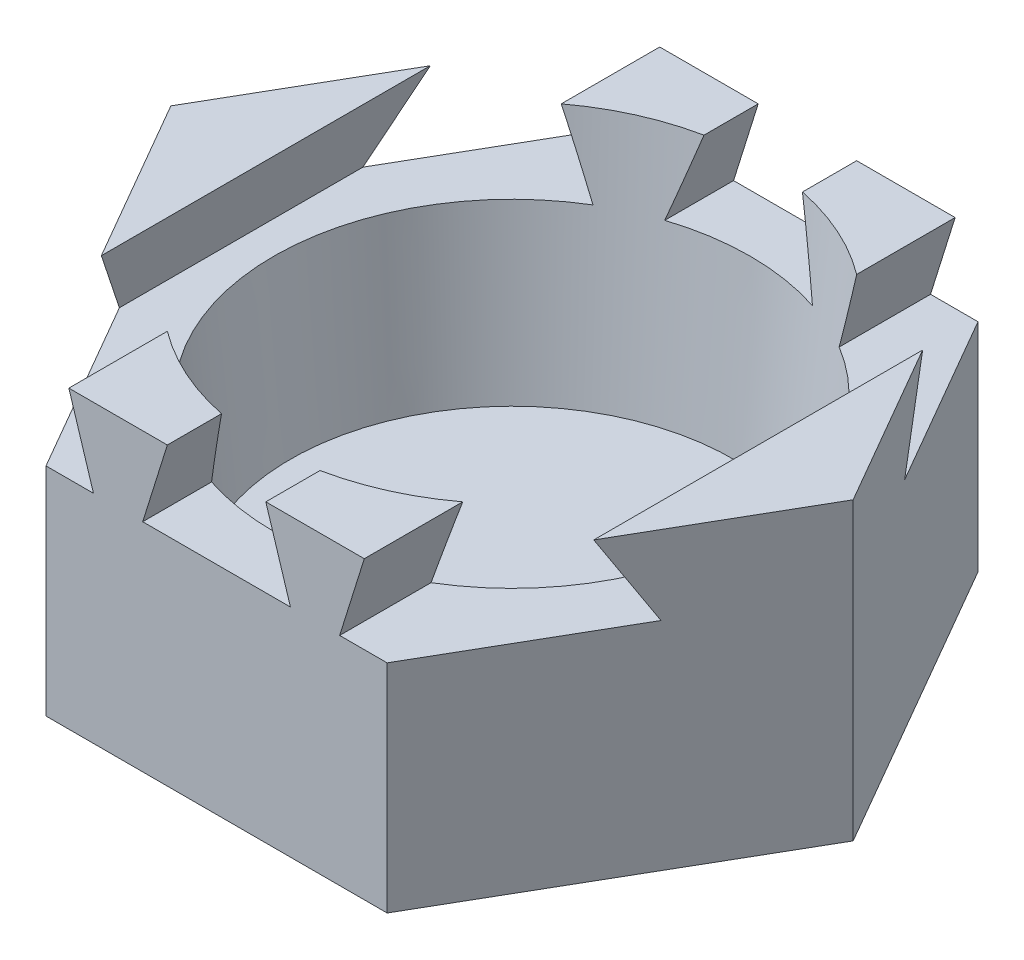
ISO-10303-21;
HEADER;
FILE_DESCRIPTION(('STEP AP214'),'2;1');
FILE_NAME('part.step','',(''),(''),'','','');
FILE_SCHEMA(('AUTOMOTIVE_DESIGN { 1 0 10303 214 1 1 1 1 }'));
ENDSEC;
DATA;
#1=APPLICATION_CONTEXT('core data for automotive mechanical design processes');
#2=APPLICATION_PROTOCOL_DEFINITION('international standard','automotive_design',2000,#1);
#3=PRODUCT_CONTEXT('',#1,'mechanical');
#4=PRODUCT('Part','Part','',(#3));
#5=PRODUCT_RELATED_PRODUCT_CATEGORY('part','',(#4));
#6=PRODUCT_DEFINITION_FORMATION('','',#4);
#7=PRODUCT_DEFINITION_CONTEXT('part definition',#1,'design');
#8=PRODUCT_DEFINITION('design','',#6,#7);
#9=PRODUCT_DEFINITION_SHAPE('','',#8);
#10=(LENGTH_UNIT() NAMED_UNIT(*) SI_UNIT(.MILLI.,.METRE.));
#11=(NAMED_UNIT(*) PLANE_ANGLE_UNIT() SI_UNIT($,.RADIAN.));
#12=(NAMED_UNIT(*) SI_UNIT($,.STERADIAN.) SOLID_ANGLE_UNIT());
#13=UNCERTAINTY_MEASURE_WITH_UNIT(LENGTH_MEASURE(1.E-05),#10,'distance_accuracy_value','');
#14=(GEOMETRIC_REPRESENTATION_CONTEXT(3) GLOBAL_UNCERTAINTY_ASSIGNED_CONTEXT((#13)) GLOBAL_UNIT_ASSIGNED_CONTEXT((#10,
#11,#12)) REPRESENTATION_CONTEXT('',''));
#15=CARTESIAN_POINT('',(0.,0.,0.));
#16=DIRECTION('',(0.,0.,1.));
#17=DIRECTION('',(1.,0.,0.));
#18=AXIS2_PLACEMENT_3D('',#15,#16,#17);
#19=CARTESIAN_POINT('',(0.,30.,0.));
#20=DIRECTION('',(0.,1.,0.));
#21=DIRECTION('',(0.,0.,1.));
#22=AXIS2_PLACEMENT_3D('',#19,#20,#21);
#23=PLANE('',#22);
#24=DIRECTION('',(0.,0.,1.));
#25=VECTOR('',#24,1.);
#26=CARTESIAN_POINT('',(25.,30.,-30.));
#27=LINE('',#26,#25);
#28=CARTESIAN_POINT('',(25.,30.,-16.698729810778));
#29=VERTEX_POINT('',#28);
#30=CARTESIAN_POINT('',(25.,30.,16.698729810778));
#31=VERTEX_POINT('',#30);
#32=EDGE_CURVE('E578',#29,#31,#27,.T.);
#33=ORIENTED_EDGE('',*,*,#32,.T.);
#34=DIRECTION('',(0.5,0.,-0.866025403784439));
#35=VECTOR('',#34,1.);
#36=CARTESIAN_POINT('',(25.9807621135332,30.,15.));
#37=LINE('',#36,#35);
#38=CARTESIAN_POINT('',(34.6410161513775,30.,0.));
#39=VERTEX_POINT('',#38);
#40=EDGE_CURVE('E277',#31,#39,#37,.T.);
#41=ORIENTED_EDGE('',*,*,#40,.T.);
#42=DIRECTION('',(-0.5,0.,-0.866025403784438));
#43=VECTOR('',#42,1.);
#44=CARTESIAN_POINT('',(25.9807621135331,30.,-15.));
#45=LINE('',#44,#43);
#46=EDGE_CURVE('E432',#39,#29,#45,.T.);
#47=ORIENTED_EDGE('',*,*,#46,.T.);
#48=EDGE_LOOP('',(#33,#41,#47));
#49=FACE_BOUND('',#48,.T.);
#50=ADVANCED_FACE('F41',(#49),#23,.T.);
#51=DIRECTION('',(0.,0.,1.));
#52=VECTOR('',#51,1.);
#53=CARTESIAN_POINT('',(15.,30.,-30.));
#54=LINE('',#53,#52);
#55=CARTESIAN_POINT('',(15.,30.,-30.));
#56=VERTEX_POINT('',#55);
#57=CARTESIAN_POINT('',(15.,30.,-20.));
#58=VERTEX_POINT('',#57);
#59=EDGE_CURVE('E58',#56,#58,#54,.T.);
#60=ORIENTED_EDGE('',*,*,#59,.F.);
#61=DIRECTION('',(-1.,0.,0.));
#62=VECTOR('',#61,1.);
#63=CARTESIAN_POINT('',(0.,30.,-30.));
#64=LINE('',#63,#62);
#65=CARTESIAN_POINT('',(5.,30.,-30.));
#66=VERTEX_POINT('',#65);
#67=EDGE_CURVE('E436',#56,#66,#64,.T.);
#68=ORIENTED_EDGE('',*,*,#67,.T.);
#69=DIRECTION('',(0.,0.,1.));
#70=VECTOR('',#69,1.);
#71=CARTESIAN_POINT('',(5.,30.,-30.));
#72=LINE('',#71,#70);
#73=CARTESIAN_POINT('',(5.,30.,-24.4948974278318));
#74=VERTEX_POINT('',#73);
#75=EDGE_CURVE('E405',#66,#74,#72,.T.);
#76=ORIENTED_EDGE('',*,*,#75,.T.);
#77=CARTESIAN_POINT('',(0.,30.,0.));
#78=DIRECTION('',(0.,-1.,0.));
#79=DIRECTION('',(1.,0.,0.));
#80=AXIS2_PLACEMENT_3D('',#77,#78,#79);
#81=CIRCLE('',#80,25.);
#82=EDGE_CURVE('E427',#74,#58,#81,.T.);
#83=ORIENTED_EDGE('',*,*,#82,.T.);
#84=EDGE_LOOP('',(#60,#68,#76,#83));
#85=FACE_BOUND('',#84,.T.);
#86=ADVANCED_FACE('F527',(#85),#23,.T.);
#87=DIRECTION('',(0.,0.,1.));
#88=VECTOR('',#87,1.);
#89=CARTESIAN_POINT('',(-15.,30.,-30.));
#90=LINE('',#89,#88);
#91=CARTESIAN_POINT('',(-15.,30.,-30.));
#92=VERTEX_POINT('',#91);
#93=CARTESIAN_POINT('',(-15.,30.,-20.));
#94=VERTEX_POINT('',#93);
#95=EDGE_CURVE('E337',#92,#94,#90,.T.);
#96=ORIENTED_EDGE('',*,*,#95,.T.);
#97=CARTESIAN_POINT('',(-5.,30.,-24.4948974278318));
#98=VERTEX_POINT('',#97);
#99=EDGE_CURVE('E331',#94,#98,#81,.T.);
#100=ORIENTED_EDGE('',*,*,#99,.T.);
#101=DIRECTION('',(0.,0.,1.));
#102=VECTOR('',#101,1.);
#103=CARTESIAN_POINT('',(-5.,30.,-30.));
#104=LINE('',#103,#102);
#105=CARTESIAN_POINT('',(-5.,30.,-30.));
#106=VERTEX_POINT('',#105);
#107=EDGE_CURVE('E420',#106,#98,#104,.T.);
#108=ORIENTED_EDGE('',*,*,#107,.F.);
#109=EDGE_CURVE('E346',#106,#92,#64,.T.);
#110=ORIENTED_EDGE('',*,*,#109,.T.);
#111=EDGE_LOOP('',(#96,#100,#108,#110));
#112=FACE_BOUND('',#111,.T.);
#113=ADVANCED_FACE('F342',(#112),#23,.T.);
#114=CARTESIAN_POINT('',(-15.,30.,20.));
#115=VERTEX_POINT('',#114);
#116=CARTESIAN_POINT('',(-15.,30.,30.));
#117=VERTEX_POINT('',#116);
#118=EDGE_CURVE('E349',#115,#117,#90,.T.);
#119=ORIENTED_EDGE('',*,*,#118,.T.);
#120=DIRECTION('',(1.,0.,0.));
#121=VECTOR('',#120,1.);
#122=CARTESIAN_POINT('',(0.,30.,30.));
#123=LINE('',#122,#121);
#124=CARTESIAN_POINT('',(-5.,30.,30.));
#125=VERTEX_POINT('',#124);
#126=EDGE_CURVE('E242',#117,#125,#123,.T.);
#127=ORIENTED_EDGE('',*,*,#126,.T.);
#128=CARTESIAN_POINT('',(-5.,30.,24.4948974278318));
#129=VERTEX_POINT('',#128);
#130=EDGE_CURVE('E404',#129,#125,#104,.T.);
#131=ORIENTED_EDGE('',*,*,#130,.F.);
#132=EDGE_CURVE('E258',#129,#115,#81,.T.);
#133=ORIENTED_EDGE('',*,*,#132,.T.);
#134=EDGE_LOOP('',(#119,#127,#131,#133));
#135=FACE_BOUND('',#134,.T.);
#136=ADVANCED_FACE('F544',(#135),#23,.T.);
#137=CARTESIAN_POINT('',(15.,30.,20.));
#138=VERTEX_POINT('',#137);
#139=CARTESIAN_POINT('',(15.,30.,30.));
#140=VERTEX_POINT('',#139);
#141=EDGE_CURVE('E216',#138,#140,#54,.T.);
#142=ORIENTED_EDGE('',*,*,#141,.F.);
#143=CARTESIAN_POINT('',(5.,30.,24.4948974278318));
#144=VERTEX_POINT('',#143);
#145=EDGE_CURVE('E426',#138,#144,#81,.T.);
#146=ORIENTED_EDGE('',*,*,#145,.T.);
#147=CARTESIAN_POINT('',(5.,30.,30.));
#148=VERTEX_POINT('',#147);
#149=EDGE_CURVE('E240',#144,#148,#72,.T.);
#150=ORIENTED_EDGE('',*,*,#149,.T.);
#151=EDGE_CURVE('E233',#148,#140,#123,.T.);
#152=ORIENTED_EDGE('',*,*,#151,.T.);
#153=EDGE_LOOP('',(#142,#146,#150,#152));
#154=FACE_BOUND('',#153,.T.);
#155=ADVANCED_FACE('F238',(#154),#23,.T.);
#156=CARTESIAN_POINT('',(25.9807621135332,30.,15.));
#157=DIRECTION('',(-0.866025403784439,0.,-0.5));
#158=DIRECTION('',(-0.5,0.,0.866025403784439));
#159=AXIS2_PLACEMENT_3D('',#156,#157,#158);
#160=PLANE('',#159);
#161=ORIENTED_EDGE('',*,*,#40,.F.);
#162=DIRECTION('',(0.26499947000159,-0.847998304005088,-0.458992546021579));
#163=VECTOR('',#162,1.);
#164=CARTESIAN_POINT('',(25.2754949757116,29.118416077723,16.2215585156157));
#165=LINE('',#164,#163);
#166=CARTESIAN_POINT('',(27.5,22.,12.3686027918558));
#167=VERTEX_POINT('',#166);
#168=EDGE_CURVE('E475',#31,#167,#165,.T.);
#169=ORIENTED_EDGE('',*,*,#168,.T.);
#170=DIRECTION('',(-0.5,0.,0.866025403784439));
#171=VECTOR('',#170,1.);
#172=CARTESIAN_POINT('',(25.9807621135332,22.,15.));
#173=LINE('',#172,#171);
#174=CARTESIAN_POINT('',(17.3205080756888,22.,30.));
#175=VERTEX_POINT('',#174);
#176=EDGE_CURVE('E592',#167,#175,#173,.T.);
#177=ORIENTED_EDGE('',*,*,#176,.T.);
#178=DIRECTION('',(0.,-1.,0.));
#179=VECTOR('',#178,1.);
#180=CARTESIAN_POINT('',(17.3205080756888,30.,30.));
#181=LINE('',#180,#179);
#182=CARTESIAN_POINT('',(17.3205080756888,0.,30.));
#183=VERTEX_POINT('',#182);
#184=EDGE_CURVE('E247',#175,#183,#181,.T.);
#185=ORIENTED_EDGE('',*,*,#184,.T.);
#186=DIRECTION('',(0.5,0.,-0.866025403784439));
#187=VECTOR('',#186,1.);
#188=CARTESIAN_POINT('',(25.9807621135332,0.,15.));
#189=LINE('',#188,#187);
#190=CARTESIAN_POINT('',(34.6410161513775,0.,0.));
#191=VERTEX_POINT('',#190);
#192=EDGE_CURVE('E253',#183,#191,#189,.T.);
#193=ORIENTED_EDGE('',*,*,#192,.T.);
#194=DIRECTION('',(0.,-1.,0.));
#195=VECTOR('',#194,1.);
#196=CARTESIAN_POINT('',(34.6410161513775,30.,0.));
#197=LINE('',#196,#195);
#198=EDGE_CURVE('E293',#39,#191,#197,.T.);
#199=ORIENTED_EDGE('',*,*,#198,.F.);
#200=EDGE_LOOP('',(#161,#169,#177,#185,#193,#199));
#201=FACE_BOUND('',#200,.T.);
#202=ADVANCED_FACE('F43',(#201),#160,.F.);
#203=CARTESIAN_POINT('',(25.9807621135331,30.,-15.));
#204=DIRECTION('',(-0.866025403784438,0.,0.5));
#205=DIRECTION('',(0.5,0.,0.866025403784438));
#206=AXIS2_PLACEMENT_3D('',#203,#204,#205);
#207=PLANE('',#206);
#208=DIRECTION('',(0.5,0.,0.866025403784438));
#209=VECTOR('',#208,1.);
#210=CARTESIAN_POINT('',(25.9807621135331,22.,-15.));
#211=LINE('',#210,#209);
#212=CARTESIAN_POINT('',(17.3205080756887,22.,-30.));
#213=VERTEX_POINT('',#212);
#214=CARTESIAN_POINT('',(27.5,22.,-12.3686027918559));
#215=VERTEX_POINT('',#214);
#216=EDGE_CURVE('E584',#213,#215,#211,.T.);
#217=ORIENTED_EDGE('',*,*,#216,.T.);
#218=DIRECTION('',(-0.26499947000159,0.847998304005088,-0.458992546021578));
#219=VECTOR('',#218,1.);
#220=CARTESIAN_POINT('',(25.2754949757116,29.118416077723,-16.2215585156157));
#221=LINE('',#220,#219);
#222=EDGE_CURVE('E481',#215,#29,#221,.T.);
#223=ORIENTED_EDGE('',*,*,#222,.T.);
#224=ORIENTED_EDGE('',*,*,#46,.F.);
#225=ORIENTED_EDGE('',*,*,#198,.T.);
#226=DIRECTION('',(-0.5,0.,-0.866025403784438));
#227=VECTOR('',#226,1.);
#228=CARTESIAN_POINT('',(25.9807621135331,0.,-15.));
#229=LINE('',#228,#227);
#230=CARTESIAN_POINT('',(17.3205080756887,0.,-30.));
#231=VERTEX_POINT('',#230);
#232=EDGE_CURVE('E257',#191,#231,#229,.T.);
#233=ORIENTED_EDGE('',*,*,#232,.T.);
#234=DIRECTION('',(0.,-1.,0.));
#235=VECTOR('',#234,1.);
#236=CARTESIAN_POINT('',(17.3205080756887,30.,-30.));
#237=LINE('',#236,#235);
#238=EDGE_CURVE('E290',#213,#231,#237,.T.);
#239=ORIENTED_EDGE('',*,*,#238,.F.);
#240=EDGE_LOOP('',(#217,#223,#224,#225,#233,#239));
#241=FACE_BOUND('',#240,.T.);
#242=ADVANCED_FACE('F549',(#241),#207,.F.);
#243=CARTESIAN_POINT('',(0.,30.,-30.));
#244=DIRECTION('',(0.,0.,1.));
#245=DIRECTION('',(1.,0.,0.));
#246=AXIS2_PLACEMENT_3D('',#243,#244,#245);
#247=PLANE('',#246);
#248=DIRECTION('',(-0.298274993135947,-0.95447997803503,0.));
#249=VECTOR('',#248,1.);
#250=CARTESIAN_POINT('',(15.,30.,-30.));
#251=LINE('',#250,#249);
#252=CARTESIAN_POINT('',(12.5,22.,-30.));
#253=VERTEX_POINT('',#252);
#254=EDGE_CURVE('E609',#56,#253,#251,.T.);
#255=ORIENTED_EDGE('',*,*,#254,.T.);
#256=DIRECTION('',(1.,0.,0.));
#257=VECTOR('',#256,1.);
#258=CARTESIAN_POINT('',(12.5,22.,-30.));
#259=LINE('',#258,#257);
#260=EDGE_CURVE('E226',#253,#213,#259,.T.);
#261=ORIENTED_EDGE('',*,*,#260,.T.);
#262=ORIENTED_EDGE('',*,*,#238,.T.);
#263=DIRECTION('',(-1.,0.,0.));
#264=VECTOR('',#263,1.);
#265=CARTESIAN_POINT('',(0.,0.,-30.));
#266=LINE('',#265,#264);
#267=CARTESIAN_POINT('',(-17.3205080756888,0.,-30.));
#268=VERTEX_POINT('',#267);
#269=EDGE_CURVE('E262',#231,#268,#266,.T.);
#270=ORIENTED_EDGE('',*,*,#269,.T.);
#271=DIRECTION('',(0.,-1.,0.));
#272=VECTOR('',#271,1.);
#273=CARTESIAN_POINT('',(-17.3205080756888,30.,-30.));
#274=LINE('',#273,#272);
#275=CARTESIAN_POINT('',(-17.3205080756888,22.,-30.));
#276=VERTEX_POINT('',#275);
#277=EDGE_CURVE('E287',#276,#268,#274,.T.);
#278=ORIENTED_EDGE('',*,*,#277,.F.);
#279=DIRECTION('',(1.,0.,0.));
#280=VECTOR('',#279,1.);
#281=CARTESIAN_POINT('',(-27.5,22.,-30.));
#282=LINE('',#281,#280);
#283=CARTESIAN_POINT('',(-12.5,22.,-30.));
#284=VERTEX_POINT('',#283);
#285=EDGE_CURVE('E458',#276,#284,#282,.T.);
#286=ORIENTED_EDGE('',*,*,#285,.T.);
#287=DIRECTION('',(-0.298274993135947,0.95447997803503,0.));
#288=VECTOR('',#287,1.);
#289=CARTESIAN_POINT('',(-12.5,22.,-30.));
#290=LINE('',#289,#288);
#291=EDGE_CURVE('E359',#284,#92,#290,.T.);
#292=ORIENTED_EDGE('',*,*,#291,.T.);
#293=ORIENTED_EDGE('',*,*,#109,.F.);
#294=DIRECTION('',(-0.298274993135947,-0.95447997803503,0.));
#295=VECTOR('',#294,1.);
#296=CARTESIAN_POINT('',(-5.,30.,-30.));
#297=LINE('',#296,#295);
#298=CARTESIAN_POINT('',(-7.5,22.,-30.));
#299=VERTEX_POINT('',#298);
#300=EDGE_CURVE('E392',#106,#299,#297,.T.);
#301=ORIENTED_EDGE('',*,*,#300,.T.);
#302=DIRECTION('',(1.,0.,0.));
#303=VECTOR('',#302,1.);
#304=CARTESIAN_POINT('',(-7.5,22.,-30.));
#305=LINE('',#304,#303);
#306=CARTESIAN_POINT('',(7.5,22.,-30.));
#307=VERTEX_POINT('',#306);
#308=EDGE_CURVE('E396',#299,#307,#305,.T.);
#309=ORIENTED_EDGE('',*,*,#308,.T.);
#310=DIRECTION('',(-0.298274993135947,0.95447997803503,0.));
#311=VECTOR('',#310,1.);
#312=CARTESIAN_POINT('',(7.5,22.,-30.));
#313=LINE('',#312,#311);
#314=EDGE_CURVE('E400',#307,#66,#313,.T.);
#315=ORIENTED_EDGE('',*,*,#314,.T.);
#316=ORIENTED_EDGE('',*,*,#67,.F.);
#317=EDGE_LOOP('',(#255,#261,#262,#270,#278,#286,#292,#293,#301,#309,#315,#316));
#318=FACE_BOUND('',#317,.T.);
#319=ADVANCED_FACE('F462',(#318),#247,.F.);
#320=CARTESIAN_POINT('',(-25.9807621135332,30.,-15.));
#321=DIRECTION('',(0.866025403784439,0.,0.5));
#322=DIRECTION('',(0.5,0.,-0.866025403784439));
#323=AXIS2_PLACEMENT_3D('',#320,#321,#322);
#324=PLANE('',#323);
#325=DIRECTION('',(-0.26499947000159,-0.847998304005088,0.458992546021579));
#326=VECTOR('',#325,1.);
#327=CARTESIAN_POINT('',(-25.2754949757116,29.118416077723,-16.2215585156157));
#328=LINE('',#327,#326);
#329=CARTESIAN_POINT('',(-25.,30.,-16.6987298107781));
#330=VERTEX_POINT('',#329);
#331=CARTESIAN_POINT('',(-27.5,22.,-12.3686027918559));
#332=VERTEX_POINT('',#331);
#333=EDGE_CURVE('E354',#330,#332,#328,.T.);
#334=ORIENTED_EDGE('',*,*,#333,.T.);
#335=DIRECTION('',(0.5,0.,-0.866025403784439));
#336=VECTOR('',#335,1.);
#337=CARTESIAN_POINT('',(-25.9807621135332,22.,-15.));
#338=LINE('',#337,#336);
#339=EDGE_CURVE('E377',#332,#276,#338,.T.);
#340=ORIENTED_EDGE('',*,*,#339,.T.);
#341=ORIENTED_EDGE('',*,*,#277,.T.);
#342=DIRECTION('',(-0.5,0.,0.866025403784439));
#343=VECTOR('',#342,1.);
#344=CARTESIAN_POINT('',(-25.9807621135332,0.,-15.));
#345=LINE('',#344,#343);
#346=CARTESIAN_POINT('',(-34.6410161513775,0.,0.));
#347=VERTEX_POINT('',#346);
#348=EDGE_CURVE('E266',#268,#347,#345,.T.);
#349=ORIENTED_EDGE('',*,*,#348,.T.);
#350=DIRECTION('',(0.,-1.,0.));
#351=VECTOR('',#350,1.);
#352=CARTESIAN_POINT('',(-34.6410161513775,30.,0.));
#353=LINE('',#352,#351);
#354=CARTESIAN_POINT('',(-34.6410161513775,30.,0.));
#355=VERTEX_POINT('',#354);
#356=EDGE_CURVE('E283',#355,#347,#353,.T.);
#357=ORIENTED_EDGE('',*,*,#356,.F.);
#358=DIRECTION('',(-0.5,0.,0.866025403784439));
#359=VECTOR('',#358,1.);
#360=CARTESIAN_POINT('',(-25.9807621135332,30.,-15.));
#361=LINE('',#360,#359);
#362=EDGE_CURVE('E249',#330,#355,#361,.T.);
#363=ORIENTED_EDGE('',*,*,#362,.F.);
#364=EDGE_LOOP('',(#334,#340,#341,#349,#357,#363));
#365=FACE_BOUND('',#364,.T.);
#366=ADVANCED_FACE('F446',(#365),#324,.F.);
#367=CARTESIAN_POINT('',(-25.9807621135332,30.,15.));
#368=DIRECTION('',(0.866025403784439,0.,-0.5));
#369=DIRECTION('',(-0.5,0.,-0.866025403784439));
#370=AXIS2_PLACEMENT_3D('',#367,#368,#369);
#371=PLANE('',#370);
#372=DIRECTION('',(0.,-1.,0.));
#373=VECTOR('',#372,1.);
#374=CARTESIAN_POINT('',(-17.3205080756888,30.,30.));
#375=LINE('',#374,#373);
#376=CARTESIAN_POINT('',(-17.3205080756888,22.,30.));
#377=VERTEX_POINT('',#376);
#378=CARTESIAN_POINT('',(-17.3205080756888,0.,30.));
#379=VERTEX_POINT('',#378);
#380=EDGE_CURVE('E280',#377,#379,#375,.T.);
#381=ORIENTED_EDGE('',*,*,#380,.F.);
#382=DIRECTION('',(-0.5,0.,-0.866025403784439));
#383=VECTOR('',#382,1.);
#384=CARTESIAN_POINT('',(-25.9807621135332,22.,15.));
#385=LINE('',#384,#383);
#386=CARTESIAN_POINT('',(-27.5,22.,12.3686027918559));
#387=VERTEX_POINT('',#386);
#388=EDGE_CURVE('E373',#377,#387,#385,.T.);
#389=ORIENTED_EDGE('',*,*,#388,.T.);
#390=DIRECTION('',(0.26499947000159,0.847998304005088,0.458992546021578));
#391=VECTOR('',#390,1.);
#392=CARTESIAN_POINT('',(-25.2754949757116,29.118416077723,16.2215585156157));
#393=LINE('',#392,#391);
#394=CARTESIAN_POINT('',(-25.,30.,16.6987298107781));
#395=VERTEX_POINT('',#394);
#396=EDGE_CURVE('E348',#387,#395,#393,.T.);
#397=ORIENTED_EDGE('',*,*,#396,.T.);
#398=DIRECTION('',(0.5,0.,0.866025403784439));
#399=VECTOR('',#398,1.);
#400=CARTESIAN_POINT('',(-25.9807621135332,30.,15.));
#401=LINE('',#400,#399);
#402=EDGE_CURVE('E243',#355,#395,#401,.T.);
#403=ORIENTED_EDGE('',*,*,#402,.F.);
#404=ORIENTED_EDGE('',*,*,#356,.T.);
#405=DIRECTION('',(0.5,0.,0.866025403784439));
#406=VECTOR('',#405,1.);
#407=CARTESIAN_POINT('',(-25.9807621135332,0.,15.));
#408=LINE('',#407,#406);
#409=EDGE_CURVE('E269',#347,#379,#408,.T.);
#410=ORIENTED_EDGE('',*,*,#409,.T.);
#411=EDGE_LOOP('',(#381,#389,#397,#403,#404,#410));
#412=FACE_BOUND('',#411,.T.);
#413=ADVANCED_FACE('F451',(#412),#371,.F.);
#414=CARTESIAN_POINT('',(0.,30.,30.));
#415=DIRECTION('',(0.,0.,-1.));
#416=DIRECTION('',(-1.,0.,0.));
#417=AXIS2_PLACEMENT_3D('',#414,#415,#416);
#418=PLANE('',#417);
#419=ORIENTED_EDGE('',*,*,#184,.F.);
#420=DIRECTION('',(1.,0.,0.));
#421=VECTOR('',#420,1.);
#422=CARTESIAN_POINT('',(12.5,22.,30.));
#423=LINE('',#422,#421);
#424=CARTESIAN_POINT('',(12.5,22.,30.));
#425=VERTEX_POINT('',#424);
#426=EDGE_CURVE('E234',#425,#175,#423,.T.);
#427=ORIENTED_EDGE('',*,*,#426,.F.);
#428=DIRECTION('',(-0.298274993135947,-0.95447997803503,0.));
#429=VECTOR('',#428,1.);
#430=CARTESIAN_POINT('',(15.,30.,30.));
#431=LINE('',#430,#429);
#432=EDGE_CURVE('E220',#140,#425,#431,.T.);
#433=ORIENTED_EDGE('',*,*,#432,.F.);
#434=ORIENTED_EDGE('',*,*,#151,.F.);
#435=DIRECTION('',(-0.298274993135947,0.95447997803503,0.));
#436=VECTOR('',#435,1.);
#437=CARTESIAN_POINT('',(7.5,22.,30.));
#438=LINE('',#437,#436);
#439=CARTESIAN_POINT('',(7.5,22.,30.));
#440=VERTEX_POINT('',#439);
#441=EDGE_CURVE('E389',#440,#148,#438,.T.);
#442=ORIENTED_EDGE('',*,*,#441,.F.);
#443=DIRECTION('',(1.,0.,0.));
#444=VECTOR('',#443,1.);
#445=CARTESIAN_POINT('',(-7.5,22.,30.));
#446=LINE('',#445,#444);
#447=CARTESIAN_POINT('',(-7.5,22.,30.));
#448=VERTEX_POINT('',#447);
#449=EDGE_CURVE('E385',#448,#440,#446,.T.);
#450=ORIENTED_EDGE('',*,*,#449,.F.);
#451=DIRECTION('',(-0.298274993135947,-0.95447997803503,0.));
#452=VECTOR('',#451,1.);
#453=CARTESIAN_POINT('',(-5.,30.,30.));
#454=LINE('',#453,#452);
#455=EDGE_CURVE('E381',#125,#448,#454,.T.);
#456=ORIENTED_EDGE('',*,*,#455,.F.);
#457=ORIENTED_EDGE('',*,*,#126,.F.);
#458=DIRECTION('',(-0.298274993135947,0.95447997803503,0.));
#459=VECTOR('',#458,1.);
#460=CARTESIAN_POINT('',(-12.5,22.,30.));
#461=LINE('',#460,#459);
#462=CARTESIAN_POINT('',(-12.5,22.,30.));
#463=VERTEX_POINT('',#462);
#464=EDGE_CURVE('E473',#463,#117,#461,.T.);
#465=ORIENTED_EDGE('',*,*,#464,.F.);
#466=DIRECTION('',(1.,0.,0.));
#467=VECTOR('',#466,1.);
#468=CARTESIAN_POINT('',(-27.5,22.,30.));
#469=LINE('',#468,#467);
#470=EDGE_CURVE('E471',#377,#463,#469,.T.);
#471=ORIENTED_EDGE('',*,*,#470,.F.);
#472=ORIENTED_EDGE('',*,*,#380,.T.);
#473=DIRECTION('',(1.,0.,0.));
#474=VECTOR('',#473,1.);
#475=CARTESIAN_POINT('',(0.,0.,30.));
#476=LINE('',#475,#474);
#477=EDGE_CURVE('E273',#379,#183,#476,.T.);
#478=ORIENTED_EDGE('',*,*,#477,.T.);
#479=EDGE_LOOP('',(#419,#427,#433,#434,#442,#450,#456,#457,#465,#471,#472,#478));
#480=FACE_BOUND('',#479,.T.);
#481=ADVANCED_FACE('F231',(#480),#418,.F.);
#482=DIRECTION('',(0.,0.,1.));
#483=VECTOR('',#482,1.);
#484=CARTESIAN_POINT('',(-25.,30.,-30.));
#485=LINE('',#484,#483);
#486=EDGE_CURVE('E367',#330,#395,#485,.T.);
#487=ORIENTED_EDGE('',*,*,#486,.F.);
#488=ORIENTED_EDGE('',*,*,#362,.T.);
#489=ORIENTED_EDGE('',*,*,#402,.T.);
#490=EDGE_LOOP('',(#487,#488,#489));
#491=FACE_BOUND('',#490,.T.);
#492=ADVANCED_FACE('F443',(#491),#23,.T.);
#493=CARTESIAN_POINT('',(0.,0.,0.));
#494=DIRECTION('',(0.,1.,0.));
#495=DIRECTION('',(0.,0.,1.));
#496=AXIS2_PLACEMENT_3D('',#493,#494,#495);
#497=PLANE('',#496);
#498=ORIENTED_EDGE('',*,*,#192,.F.);
#499=ORIENTED_EDGE('',*,*,#477,.F.);
#500=ORIENTED_EDGE('',*,*,#409,.F.);
#501=ORIENTED_EDGE('',*,*,#348,.F.);
#502=ORIENTED_EDGE('',*,*,#269,.F.);
#503=ORIENTED_EDGE('',*,*,#232,.F.);
#504=EDGE_LOOP('',(#498,#499,#500,#501,#502,#503));
#505=FACE_BOUND('',#504,.T.);
#506=ADVANCED_FACE('F468',(#505),#497,.F.);
#507=CARTESIAN_POINT('',(0.,4.99999999999999,0.));
#508=DIRECTION('',(0.,1.,0.));
#509=DIRECTION('',(-1.,0.,0.));
#510=AXIS2_PLACEMENT_3D('',#507,#508,#509);
#511=CONICAL_SURFACE('',#510,22.5,0.0996686524911623);
#512=ORIENTED_EDGE('',*,*,#145,.F.);
#513=CARTESIAN_POINT('',(7.20142602495546,5.04456327985744,0.));
#514=DIRECTION('',(-0.95447997803503,0.298274993135947,0.));
#515=DIRECTION('',(0.298274993135947,0.95447997803503,0.));
#516=AXIS2_PLACEMENT_3D('',#513,#514,#515);
#517=ELLIPSE('',#516,75.4486860979617,21.3211167114978);
#518=CARTESIAN_POINT('',(12.5,22.,20.7217277271949));
#519=VERTEX_POINT('',#518);
#520=EDGE_CURVE('E11',#138,#519,#517,.F.);
#521=ORIENTED_EDGE('',*,*,#520,.T.);
#522=CARTESIAN_POINT('',(0.,22.,0.));
#523=DIRECTION('',(0.,-1.,0.));
#524=DIRECTION('',(1.,0.,0.));
#525=AXIS2_PLACEMENT_3D('',#522,#523,#524);
#526=CIRCLE('',#525,24.2);
#527=CARTESIAN_POINT('',(12.5,22.,-20.7217277271949));
#528=VERTEX_POINT('',#527);
#529=EDGE_CURVE('E45',#519,#528,#526,.F.);
#530=ORIENTED_EDGE('',*,*,#529,.T.);
#531=EDGE_CURVE('E51',#528,#58,#517,.F.);
#532=ORIENTED_EDGE('',*,*,#531,.T.);
#533=ORIENTED_EDGE('',*,*,#82,.F.);
#534=CARTESIAN_POINT('',(-9.48306595365423,76.3458110516935,0.));
#535=DIRECTION('',(0.95447997803503,0.298274993135947,0.));
#536=DIRECTION('',(-0.298274993135947,0.95447997803503,0.));
#537=AXIS2_PLACEMENT_3D('',#534,#535,#536);
#538=ELLIPSE('',#537,99.353220307217,28.0763220062298);
#539=CARTESIAN_POINT('',(7.5,22.,-23.0084766988169));
#540=VERTEX_POINT('',#539);
#541=EDGE_CURVE('E306',#74,#540,#538,.F.);
#542=ORIENTED_EDGE('',*,*,#541,.T.);
#543=CARTESIAN_POINT('',(0.,22.,0.));
#544=DIRECTION('',(0.,-1.,0.));
#545=DIRECTION('',(1.,0.,0.));
#546=AXIS2_PLACEMENT_3D('',#543,#544,#545);
#547=CIRCLE('',#546,24.2);
#548=CARTESIAN_POINT('',(-7.5,22.,-23.0084766988169));
#549=VERTEX_POINT('',#548);
#550=EDGE_CURVE('E301',#540,#549,#547,.F.);
#551=ORIENTED_EDGE('',*,*,#550,.T.);
#552=CARTESIAN_POINT('',(9.48306595365419,76.3458110516934,0.));
#553=DIRECTION('',(-0.95447997803503,0.298274993135947,0.));
#554=DIRECTION('',(0.298274993135947,0.95447997803503,0.));
#555=AXIS2_PLACEMENT_3D('',#552,#553,#554);
#556=ELLIPSE('',#555,99.353220307217,28.0763220062298);
#557=EDGE_CURVE('E297',#549,#98,#556,.F.);
#558=ORIENTED_EDGE('',*,*,#557,.T.);
#559=ORIENTED_EDGE('',*,*,#99,.F.);
#560=CARTESIAN_POINT('',(-7.20142602495546,5.04456327985747,0.));
#561=DIRECTION('',(0.95447997803503,0.298274993135947,0.));
#562=DIRECTION('',(-0.298274993135947,0.95447997803503,0.));
#563=AXIS2_PLACEMENT_3D('',#560,#561,#562);
#564=ELLIPSE('',#563,75.4486860979617,21.3211167114978);
#565=CARTESIAN_POINT('',(-12.5,22.,-20.721727727195));
#566=VERTEX_POINT('',#565);
#567=EDGE_CURVE('E319',#94,#566,#564,.F.);
#568=ORIENTED_EDGE('',*,*,#567,.T.);
#569=CARTESIAN_POINT('',(0.,22.,0.));
#570=DIRECTION('',(0.,-1.,0.));
#571=DIRECTION('',(1.,0.,0.));
#572=AXIS2_PLACEMENT_3D('',#569,#570,#571);
#573=CIRCLE('',#572,24.2);
#574=CARTESIAN_POINT('',(-12.5,22.,20.721727727195));
#575=VERTEX_POINT('',#574);
#576=EDGE_CURVE('E312',#566,#575,#573,.F.);
#577=ORIENTED_EDGE('',*,*,#576,.T.);
#578=EDGE_CURVE('E316',#575,#115,#564,.F.);
#579=ORIENTED_EDGE('',*,*,#578,.T.);
#580=ORIENTED_EDGE('',*,*,#132,.F.);
#581=CARTESIAN_POINT('',(-7.5,22.,23.0084766988169));
#582=VERTEX_POINT('',#581);
#583=EDGE_CURVE('E302',#129,#582,#556,.F.);
#584=ORIENTED_EDGE('',*,*,#583,.T.);
#585=CARTESIAN_POINT('',(7.5,22.,23.0084766988169));
#586=VERTEX_POINT('',#585);
#587=EDGE_CURVE('E307',#582,#586,#547,.F.);
#588=ORIENTED_EDGE('',*,*,#587,.T.);
#589=EDGE_CURVE('E311',#586,#144,#538,.F.);
#590=ORIENTED_EDGE('',*,*,#589,.T.);
#591=EDGE_LOOP('',(#512,#521,#530,#532,#533,#542,#551,#558,#559,#568,#577,#579,#580,#584,#588,#590));
#592=FACE_BOUND('',#591,.T.);
#593=CARTESIAN_POINT('',(0.,4.99999999999999,0.));
#594=DIRECTION('',(0.,-1.,0.));
#595=DIRECTION('',(1.,0.,0.));
#596=AXIS2_PLACEMENT_3D('',#593,#594,#595);
#597=CIRCLE('',#596,22.5);
#598=CARTESIAN_POINT('',(22.5,5.,0.));
#599=VERTEX_POINT('',#598);
#600=EDGE_CURVE('E409',#599,#599,#597,.T.);
#601=ORIENTED_EDGE('',*,*,#600,.T.);
#602=EDGE_LOOP('',(#601));
#603=FACE_BOUND('',#602,.T.);
#604=ADVANCED_FACE('F329',(#592,#603),#511,.F.);
#605=CARTESIAN_POINT('',(22.5,5.,0.));
#606=DIRECTION('',(0.,-1.,0.));
#607=DIRECTION('',(1.,0.,0.));
#608=AXIS2_PLACEMENT_3D('',#605,#606,#607);
#609=PLANE('',#608);
#610=ORIENTED_EDGE('',*,*,#600,.F.);
#611=EDGE_LOOP('',(#610));
#612=FACE_BOUND('',#611,.T.);
#613=ADVANCED_FACE('F624',(#612),#609,.F.);
#614=CARTESIAN_POINT('',(-5.,30.,-30.));
#615=DIRECTION('',(-0.95447997803503,0.298274993135947,0.));
#616=DIRECTION('',(-0.298274993135947,-0.95447997803503,0.));
#617=AXIS2_PLACEMENT_3D('',#614,#615,#616);
#618=PLANE('',#617);
#619=DIRECTION('',(0.,0.,1.));
#620=VECTOR('',#619,1.);
#621=CARTESIAN_POINT('',(-7.5,22.,-30.));
#622=LINE('',#621,#620);
#623=EDGE_CURVE('E415',#299,#549,#622,.T.);
#624=ORIENTED_EDGE('',*,*,#623,.F.);
#625=ORIENTED_EDGE('',*,*,#300,.F.);
#626=ORIENTED_EDGE('',*,*,#107,.T.);
#627=ORIENTED_EDGE('',*,*,#557,.F.);
#628=EDGE_LOOP('',(#624,#625,#626,#627));
#629=FACE_BOUND('',#628,.T.);
#630=ADVANCED_FACE('F622',(#629),#618,.F.);
#631=CARTESIAN_POINT('',(-7.5,22.,-30.));
#632=DIRECTION('',(0.,-1.,0.));
#633=DIRECTION('',(1.,0.,0.));
#634=AXIS2_PLACEMENT_3D('',#631,#632,#633);
#635=PLANE('',#634);
#636=DIRECTION('',(0.,0.,1.));
#637=VECTOR('',#636,1.);
#638=CARTESIAN_POINT('',(7.5,22.,-30.));
#639=LINE('',#638,#637);
#640=EDGE_CURVE('E410',#307,#540,#639,.T.);
#641=ORIENTED_EDGE('',*,*,#640,.F.);
#642=ORIENTED_EDGE('',*,*,#308,.F.);
#643=ORIENTED_EDGE('',*,*,#623,.T.);
#644=ORIENTED_EDGE('',*,*,#550,.F.);
#645=EDGE_LOOP('',(#641,#642,#643,#644));
#646=FACE_BOUND('',#645,.T.);
#647=ADVANCED_FACE('F523',(#646),#635,.F.);
#648=CARTESIAN_POINT('',(7.5,22.,-30.));
#649=DIRECTION('',(0.95447997803503,0.298274993135947,0.));
#650=DIRECTION('',(-0.298274993135947,0.95447997803503,0.));
#651=AXIS2_PLACEMENT_3D('',#648,#649,#650);
#652=PLANE('',#651);
#653=ORIENTED_EDGE('',*,*,#75,.F.);
#654=ORIENTED_EDGE('',*,*,#314,.F.);
#655=ORIENTED_EDGE('',*,*,#640,.T.);
#656=ORIENTED_EDGE('',*,*,#541,.F.);
#657=EDGE_LOOP('',(#653,#654,#655,#656));
#658=FACE_BOUND('',#657,.T.);
#659=ADVANCED_FACE('F516',(#658),#652,.F.);
#660=EDGE_CURVE('E414',#586,#440,#639,.T.);
#661=ORIENTED_EDGE('',*,*,#660,.T.);
#662=ORIENTED_EDGE('',*,*,#441,.T.);
#663=ORIENTED_EDGE('',*,*,#149,.F.);
#664=ORIENTED_EDGE('',*,*,#589,.F.);
#665=EDGE_LOOP('',(#661,#662,#663,#664));
#666=FACE_BOUND('',#665,.T.);
#667=ADVANCED_FACE('F514',(#666),#652,.F.);
#668=EDGE_CURVE('E419',#582,#448,#622,.T.);
#669=ORIENTED_EDGE('',*,*,#668,.T.);
#670=ORIENTED_EDGE('',*,*,#449,.T.);
#671=ORIENTED_EDGE('',*,*,#660,.F.);
#672=ORIENTED_EDGE('',*,*,#587,.F.);
#673=EDGE_LOOP('',(#669,#670,#671,#672));
#674=FACE_BOUND('',#673,.T.);
#675=ADVANCED_FACE('F506',(#674),#635,.F.);
#676=ORIENTED_EDGE('',*,*,#130,.T.);
#677=ORIENTED_EDGE('',*,*,#455,.T.);
#678=ORIENTED_EDGE('',*,*,#668,.F.);
#679=ORIENTED_EDGE('',*,*,#583,.F.);
#680=EDGE_LOOP('',(#676,#677,#678,#679));
#681=FACE_BOUND('',#680,.T.);
#682=ADVANCED_FACE('F499',(#681),#618,.F.);
#683=CARTESIAN_POINT('',(-12.5,22.,-30.));
#684=DIRECTION('',(0.95447997803503,0.298274993135947,0.));
#685=DIRECTION('',(-0.298274993135947,0.95447997803503,0.));
#686=AXIS2_PLACEMENT_3D('',#683,#684,#685);
#687=PLANE('',#686);
#688=ORIENTED_EDGE('',*,*,#95,.F.);
#689=ORIENTED_EDGE('',*,*,#291,.F.);
#690=DIRECTION('',(0.,0.,1.));
#691=VECTOR('',#690,1.);
#692=CARTESIAN_POINT('',(-12.5,22.,-30.));
#693=LINE('',#692,#691);
#694=EDGE_CURVE('E339',#284,#566,#693,.T.);
#695=ORIENTED_EDGE('',*,*,#694,.T.);
#696=ORIENTED_EDGE('',*,*,#567,.F.);
#697=EDGE_LOOP('',(#688,#689,#695,#696));
#698=FACE_BOUND('',#697,.T.);
#699=ADVANCED_FACE('F335',(#698),#687,.F.);
#700=EDGE_CURVE('E66',#575,#463,#693,.T.);
#701=ORIENTED_EDGE('',*,*,#700,.T.);
#702=ORIENTED_EDGE('',*,*,#464,.T.);
#703=ORIENTED_EDGE('',*,*,#118,.F.);
#704=ORIENTED_EDGE('',*,*,#578,.F.);
#705=EDGE_LOOP('',(#701,#702,#703,#704));
#706=FACE_BOUND('',#705,.T.);
#707=ADVANCED_FACE('F555',(#706),#687,.F.);
#708=CARTESIAN_POINT('',(-27.5,22.,-30.));
#709=DIRECTION('',(0.,-1.,0.));
#710=DIRECTION('',(1.,0.,0.));
#711=AXIS2_PLACEMENT_3D('',#708,#709,#710);
#712=PLANE('',#711);
#713=DIRECTION('',(0.,0.,1.));
#714=VECTOR('',#713,1.);
#715=CARTESIAN_POINT('',(-27.5,22.,-30.));
#716=LINE('',#715,#714);
#717=EDGE_CURVE('E363',#332,#387,#716,.T.);
#718=ORIENTED_EDGE('',*,*,#717,.T.);
#719=ORIENTED_EDGE('',*,*,#388,.F.);
#720=ORIENTED_EDGE('',*,*,#470,.T.);
#721=ORIENTED_EDGE('',*,*,#700,.F.);
#722=ORIENTED_EDGE('',*,*,#576,.F.);
#723=ORIENTED_EDGE('',*,*,#694,.F.);
#724=ORIENTED_EDGE('',*,*,#285,.F.);
#725=ORIENTED_EDGE('',*,*,#339,.F.);
#726=EDGE_LOOP('',(#718,#719,#720,#721,#722,#723,#724,#725));
#727=FACE_BOUND('',#726,.T.);
#728=ADVANCED_FACE('F455',(#727),#712,.F.);
#729=CARTESIAN_POINT('',(-25.,30.,-30.));
#730=DIRECTION('',(-0.95447997803503,0.298274993135947,0.));
#731=DIRECTION('',(-0.298274993135947,-0.95447997803503,0.));
#732=AXIS2_PLACEMENT_3D('',#729,#730,#731);
#733=PLANE('',#732);
#734=ORIENTED_EDGE('',*,*,#486,.T.);
#735=ORIENTED_EDGE('',*,*,#396,.F.);
#736=ORIENTED_EDGE('',*,*,#717,.F.);
#737=ORIENTED_EDGE('',*,*,#333,.F.);
#738=EDGE_LOOP('',(#734,#735,#736,#737));
#739=FACE_BOUND('',#738,.T.);
#740=ADVANCED_FACE('F454',(#739),#733,.F.);
#741=CARTESIAN_POINT('',(27.5,22.,-30.));
#742=DIRECTION('',(0.95447997803503,0.298274993135947,0.));
#743=DIRECTION('',(-0.298274993135947,0.95447997803503,0.));
#744=AXIS2_PLACEMENT_3D('',#741,#742,#743);
#745=PLANE('',#744);
#746=ORIENTED_EDGE('',*,*,#32,.F.);
#747=ORIENTED_EDGE('',*,*,#222,.F.);
#748=DIRECTION('',(0.,0.,1.));
#749=VECTOR('',#748,1.);
#750=CARTESIAN_POINT('',(27.5,22.,-30.));
#751=LINE('',#750,#749);
#752=EDGE_CURVE('E585',#215,#167,#751,.T.);
#753=ORIENTED_EDGE('',*,*,#752,.T.);
#754=ORIENTED_EDGE('',*,*,#168,.F.);
#755=EDGE_LOOP('',(#746,#747,#753,#754));
#756=FACE_BOUND('',#755,.T.);
#757=ADVANCED_FACE('F567',(#756),#745,.F.);
#758=CARTESIAN_POINT('',(12.5,22.,-30.));
#759=DIRECTION('',(0.,-1.,0.));
#760=DIRECTION('',(1.,0.,0.));
#761=AXIS2_PLACEMENT_3D('',#758,#759,#760);
#762=PLANE('',#761);
#763=ORIENTED_EDGE('',*,*,#752,.F.);
#764=ORIENTED_EDGE('',*,*,#216,.F.);
#765=ORIENTED_EDGE('',*,*,#260,.F.);
#766=DIRECTION('',(0.,0.,1.));
#767=VECTOR('',#766,1.);
#768=CARTESIAN_POINT('',(12.5,22.,-30.));
#769=LINE('',#768,#767);
#770=EDGE_CURVE('E601',#253,#528,#769,.T.);
#771=ORIENTED_EDGE('',*,*,#770,.T.);
#772=ORIENTED_EDGE('',*,*,#529,.F.);
#773=EDGE_CURVE('E600',#519,#425,#769,.T.);
#774=ORIENTED_EDGE('',*,*,#773,.T.);
#775=ORIENTED_EDGE('',*,*,#426,.T.);
#776=ORIENTED_EDGE('',*,*,#176,.F.);
#777=EDGE_LOOP('',(#763,#764,#765,#771,#772,#774,#775,#776));
#778=FACE_BOUND('',#777,.T.);
#779=ADVANCED_FACE('F571',(#778),#762,.F.);
#780=CARTESIAN_POINT('',(15.,30.,-30.));
#781=DIRECTION('',(-0.95447997803503,0.298274993135947,0.));
#782=DIRECTION('',(-0.298274993135947,-0.95447997803503,0.));
#783=AXIS2_PLACEMENT_3D('',#780,#781,#782);
#784=PLANE('',#783);
#785=ORIENTED_EDGE('',*,*,#141,.T.);
#786=ORIENTED_EDGE('',*,*,#432,.T.);
#787=ORIENTED_EDGE('',*,*,#773,.F.);
#788=ORIENTED_EDGE('',*,*,#520,.F.);
#789=EDGE_LOOP('',(#785,#786,#787,#788));
#790=FACE_BOUND('',#789,.T.);
#791=ADVANCED_FACE('F218',(#790),#784,.F.);
#792=ORIENTED_EDGE('',*,*,#770,.F.);
#793=ORIENTED_EDGE('',*,*,#254,.F.);
#794=ORIENTED_EDGE('',*,*,#59,.T.);
#795=ORIENTED_EDGE('',*,*,#531,.F.);
#796=EDGE_LOOP('',(#792,#793,#794,#795));
#797=FACE_BOUND('',#796,.T.);
#798=ADVANCED_FACE('F615',(#797),#784,.F.);
#799=CLOSED_SHELL('',(#50,#86,#113,#136,#155,#202,#242,#319,#366,#413,#481,#492,#506,#604,#613,
#630,#647,#659,#667,#675,#682,#699,#707,#728,#740,#757,#779,#791,#798));
#800=MANIFOLD_SOLID_BREP('B2',#799);
#801=ADVANCED_BREP_SHAPE_REPRESENTATION('',(#18,#800),#14);
#802=SHAPE_DEFINITION_REPRESENTATION(#9,#801);
ENDSEC;
END-ISO-10303-21;
